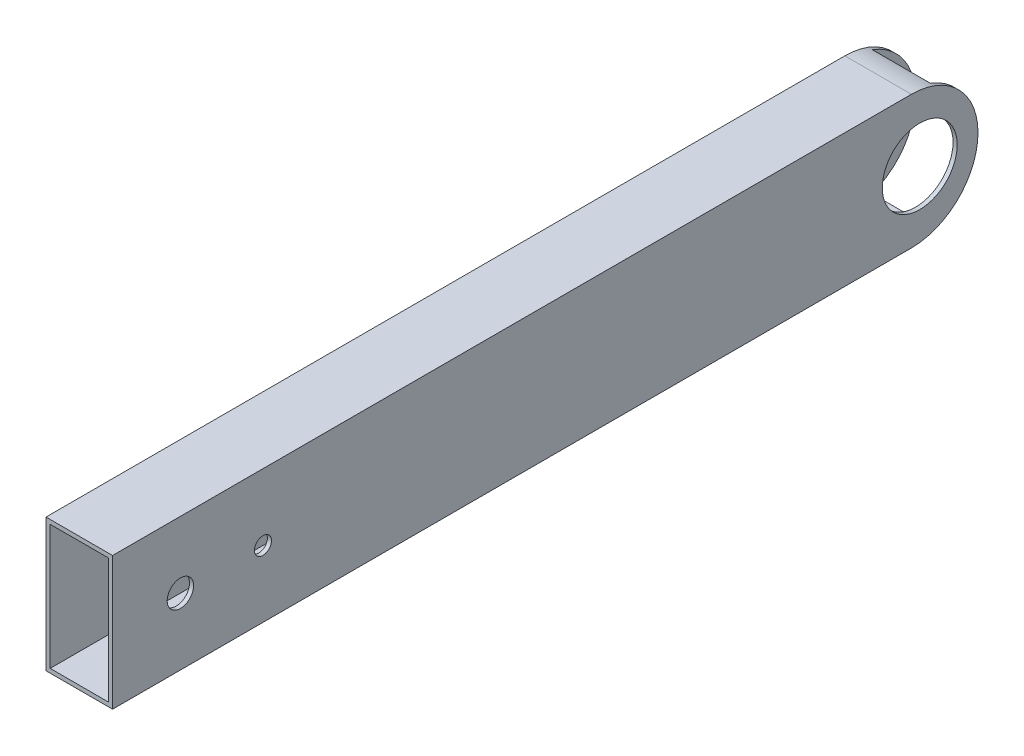
ISO-10303-21;
HEADER;
FILE_DESCRIPTION(('STEP AP214'),'2;1');
FILE_NAME('part.step','',(''),(''),'','','');
FILE_SCHEMA(('AUTOMOTIVE_DESIGN { 1 0 10303 214 1 1 1 1 }'));
ENDSEC;
DATA;
#1=APPLICATION_CONTEXT('core data for automotive mechanical design processes');
#2=APPLICATION_PROTOCOL_DEFINITION('international standard','automotive_design',2000,#1);
#3=PRODUCT_CONTEXT('',#1,'mechanical');
#4=PRODUCT('Part','Part','',(#3));
#5=PRODUCT_RELATED_PRODUCT_CATEGORY('part','',(#4));
#6=PRODUCT_DEFINITION_FORMATION('','',#4);
#7=PRODUCT_DEFINITION_CONTEXT('part definition',#1,'design');
#8=PRODUCT_DEFINITION('design','',#6,#7);
#9=PRODUCT_DEFINITION_SHAPE('','',#8);
#10=(LENGTH_UNIT() NAMED_UNIT(*) SI_UNIT(.MILLI.,.METRE.));
#11=(NAMED_UNIT(*) PLANE_ANGLE_UNIT() SI_UNIT($,.RADIAN.));
#12=(NAMED_UNIT(*) SI_UNIT($,.STERADIAN.) SOLID_ANGLE_UNIT());
#13=UNCERTAINTY_MEASURE_WITH_UNIT(LENGTH_MEASURE(1.E-05),#10,'distance_accuracy_value','');
#14=(GEOMETRIC_REPRESENTATION_CONTEXT(3) GLOBAL_UNCERTAINTY_ASSIGNED_CONTEXT((#13)) GLOBAL_UNIT_ASSIGNED_CONTEXT((#10,
#11,#12)) REPRESENTATION_CONTEXT('',''));
#15=CARTESIAN_POINT('',(0.,0.,0.));
#16=DIRECTION('',(0.,0.,1.));
#17=DIRECTION('',(1.,0.,0.));
#18=AXIS2_PLACEMENT_3D('',#15,#16,#17);
#19=CARTESIAN_POINT('',(12.7,0.,-142.875));
#20=DIRECTION('',(1.,0.,0.));
#21=DIRECTION('',(0.,0.,-1.));
#22=AXIS2_PLACEMENT_3D('',#19,#20,#21);
#23=CYLINDRICAL_SURFACE('',#22,14.2875);
#24=CARTESIAN_POINT('',(-11.1125,0.,-142.875));
#25=DIRECTION('',(1.,0.,0.));
#26=DIRECTION('',(0.,0.,-1.));
#27=AXIS2_PLACEMENT_3D('',#24,#25,#26);
#28=CIRCLE('',#27,14.2875);
#29=CARTESIAN_POINT('',(-11.1125,0.,-157.1625));
#30=VERTEX_POINT('',#29);
#31=EDGE_CURVE('E99',#30,#30,#28,.F.);
#32=ORIENTED_EDGE('',*,*,#31,.F.);
#33=EDGE_LOOP('',(#32));
#34=FACE_BOUND('',#33,.T.);
#35=CARTESIAN_POINT('',(-12.7,0.,-142.875));
#36=DIRECTION('',(1.,0.,0.));
#37=DIRECTION('',(0.,0.,-1.));
#38=AXIS2_PLACEMENT_3D('',#35,#36,#37);
#39=CIRCLE('',#38,14.2875);
#40=CARTESIAN_POINT('',(-12.7,0.,-157.1625));
#41=VERTEX_POINT('',#40);
#42=EDGE_CURVE('E19',#41,#41,#39,.T.);
#43=ORIENTED_EDGE('',*,*,#42,.F.);
#44=EDGE_LOOP('',(#43));
#45=FACE_BOUND('',#44,.T.);
#46=ADVANCED_FACE('F16',(#34,#45),#23,.F.);
#47=CARTESIAN_POINT('',(-12.7,0.,107.714500000008));
#48=DIRECTION('',(-1.,0.,0.));
#49=DIRECTION('',(0.,0.,1.));
#50=AXIS2_PLACEMENT_3D('',#47,#48,#49);
#51=CYLINDRICAL_SURFACE('',#50,7.9375);
#52=CARTESIAN_POINT('',(-11.1125,0.,107.714500000008));
#53=DIRECTION('',(-1.,0.,0.));
#54=DIRECTION('',(0.,0.,1.));
#55=AXIS2_PLACEMENT_3D('',#52,#53,#54);
#56=CIRCLE('',#55,7.9375);
#57=CARTESIAN_POINT('',(-11.1125,0.,115.652000000008));
#58=VERTEX_POINT('',#57);
#59=EDGE_CURVE('E150',#58,#58,#56,.T.);
#60=ORIENTED_EDGE('',*,*,#59,.F.);
#61=EDGE_LOOP('',(#60));
#62=FACE_BOUND('',#61,.T.);
#63=CARTESIAN_POINT('',(-12.7,0.,107.714500000008));
#64=DIRECTION('',(-1.,0.,0.));
#65=DIRECTION('',(0.,0.,1.));
#66=AXIS2_PLACEMENT_3D('',#63,#64,#65);
#67=CIRCLE('',#66,7.9375);
#68=CARTESIAN_POINT('',(-12.7,0.,115.652000000008));
#69=VERTEX_POINT('',#68);
#70=EDGE_CURVE('E100',#69,#69,#67,.F.);
#71=ORIENTED_EDGE('',*,*,#70,.F.);
#72=EDGE_LOOP('',(#71));
#73=FACE_BOUND('',#72,.T.);
#74=ADVANCED_FACE('F163',(#62,#73),#51,.F.);
#75=CARTESIAN_POINT('',(-12.7,25.4,-165.1));
#76=DIRECTION('',(-1.,0.,0.));
#77=DIRECTION('',(0.,0.,1.));
#78=AXIS2_PLACEMENT_3D('',#75,#76,#77);
#79=PLANE('',#78);
#80=ORIENTED_EDGE('',*,*,#70,.T.);
#81=EDGE_LOOP('',(#80));
#82=FACE_BOUND('',#81,.T.);
#83=ORIENTED_EDGE('',*,*,#42,.T.);
#84=EDGE_LOOP('',(#83));
#85=FACE_BOUND('',#84,.T.);
#86=DIRECTION('',(0.,0.,1.));
#87=VECTOR('',#86,1.);
#88=CARTESIAN_POINT('',(-12.7,25.4,-165.1));
#89=LINE('',#88,#87);
#90=CARTESIAN_POINT('',(-12.7,25.4,-139.7));
#91=VERTEX_POINT('',#90);
#92=CARTESIAN_POINT('',(-12.7,25.4,165.1));
#93=VERTEX_POINT('',#92);
#94=EDGE_CURVE('E334',#91,#93,#89,.T.);
#95=ORIENTED_EDGE('',*,*,#94,.F.);
#96=CARTESIAN_POINT('',(-12.7,0.,-139.7));
#97=DIRECTION('',(1.,0.,0.));
#98=DIRECTION('',(0.,0.,-1.));
#99=AXIS2_PLACEMENT_3D('',#96,#97,#98);
#100=CIRCLE('',#99,25.4);
#101=CARTESIAN_POINT('',(-12.7,-25.4,-139.7));
#102=VERTEX_POINT('',#101);
#103=EDGE_CURVE('E64',#102,#91,#100,.T.);
#104=ORIENTED_EDGE('',*,*,#103,.F.);
#105=DIRECTION('',(0.,0.,-1.));
#106=VECTOR('',#105,1.);
#107=CARTESIAN_POINT('',(-12.7,-25.4,-165.1));
#108=LINE('',#107,#106);
#109=CARTESIAN_POINT('',(-12.7,-25.4,165.1));
#110=VERTEX_POINT('',#109);
#111=EDGE_CURVE('E149',#110,#102,#108,.T.);
#112=ORIENTED_EDGE('',*,*,#111,.F.);
#113=DIRECTION('',(0.,1.,0.));
#114=VECTOR('',#113,1.);
#115=CARTESIAN_POINT('',(-12.7,0.,165.1));
#116=LINE('',#115,#114);
#117=EDGE_CURVE('E71',#93,#110,#116,.F.);
#118=ORIENTED_EDGE('',*,*,#117,.F.);
#119=EDGE_LOOP('',(#95,#104,#112,#118));
#120=FACE_BOUND('',#119,.T.);
#121=ADVANCED_FACE('F160',(#82,#85,#120),#79,.T.);
#122=CARTESIAN_POINT('',(-11.1125,23.8125,-165.1));
#123=DIRECTION('',(0.,-1.,0.));
#124=DIRECTION('',(0.,0.,-1.));
#125=AXIS2_PLACEMENT_3D('',#122,#123,#124);
#126=PLANE('',#125);
#127=DIRECTION('',(0.,0.,-1.));
#128=VECTOR('',#127,1.);
#129=CARTESIAN_POINT('',(-11.1125,23.8125,-165.1));
#130=LINE('',#129,#128);
#131=CARTESIAN_POINT('',(-11.1125,23.8124999999995,-148.538825925994));
#132=VERTEX_POINT('',#131);
#133=CARTESIAN_POINT('',(-11.1125,23.8125,165.1));
#134=VERTEX_POINT('',#133);
#135=EDGE_CURVE('E89',#132,#134,#130,.F.);
#136=ORIENTED_EDGE('',*,*,#135,.F.);
#137=DIRECTION('',(1.,0.,0.));
#138=VECTOR('',#137,1.);
#139=CARTESIAN_POINT('',(-45.81144,23.812499999999,-148.538825925995));
#140=LINE('',#139,#138);
#141=CARTESIAN_POINT('',(11.1125,23.8124999999995,-148.538825925994));
#142=VERTEX_POINT('',#141);
#143=EDGE_CURVE('E146',#142,#132,#140,.F.);
#144=ORIENTED_EDGE('',*,*,#143,.F.);
#145=DIRECTION('',(0.,0.,1.));
#146=VECTOR('',#145,1.);
#147=CARTESIAN_POINT('',(11.1125,23.8125,-165.1));
#148=LINE('',#147,#146);
#149=CARTESIAN_POINT('',(11.1125,23.8125,165.1));
#150=VERTEX_POINT('',#149);
#151=EDGE_CURVE('E106',#150,#142,#148,.F.);
#152=ORIENTED_EDGE('',*,*,#151,.F.);
#153=DIRECTION('',(1.,0.,0.));
#154=VECTOR('',#153,1.);
#155=CARTESIAN_POINT('',(0.,23.8125,165.1));
#156=LINE('',#155,#154);
#157=EDGE_CURVE('E103',#134,#150,#156,.T.);
#158=ORIENTED_EDGE('',*,*,#157,.F.);
#159=EDGE_LOOP('',(#136,#144,#152,#158));
#160=FACE_BOUND('',#159,.T.);
#161=ADVANCED_FACE('F104',(#160),#126,.T.);
#162=CARTESIAN_POINT('',(-11.1125,-23.8125,-165.1));
#163=DIRECTION('',(1.,0.,0.));
#164=DIRECTION('',(0.,0.,-1.));
#165=AXIS2_PLACEMENT_3D('',#162,#163,#164);
#166=PLANE('',#165);
#167=ORIENTED_EDGE('',*,*,#59,.T.);
#168=EDGE_LOOP('',(#167));
#169=FACE_BOUND('',#168,.T.);
#170=ORIENTED_EDGE('',*,*,#31,.T.);
#171=EDGE_LOOP('',(#170));
#172=FACE_BOUND('',#171,.T.);
#173=DIRECTION('',(0.,0.,1.));
#174=VECTOR('',#173,1.);
#175=CARTESIAN_POINT('',(-11.1125,-23.8125,-165.1));
#176=LINE('',#175,#174);
#177=CARTESIAN_POINT('',(-11.1125,-23.8124999999995,-148.538825925994));
#178=VERTEX_POINT('',#177);
#179=CARTESIAN_POINT('',(-11.1125,-23.8125,165.1));
#180=VERTEX_POINT('',#179);
#181=EDGE_CURVE('E84',#178,#180,#176,.T.);
#182=ORIENTED_EDGE('',*,*,#181,.F.);
#183=CARTESIAN_POINT('',(-11.1125,0.,-139.7));
#184=DIRECTION('',(1.,0.,0.));
#185=DIRECTION('',(0.,0.,-1.));
#186=AXIS2_PLACEMENT_3D('',#183,#184,#185);
#187=CIRCLE('',#186,25.4);
#188=EDGE_CURVE('E96',#132,#178,#187,.F.);
#189=ORIENTED_EDGE('',*,*,#188,.F.);
#190=ORIENTED_EDGE('',*,*,#135,.T.);
#191=DIRECTION('',(0.,1.,0.));
#192=VECTOR('',#191,1.);
#193=CARTESIAN_POINT('',(-11.1125,0.,165.1));
#194=LINE('',#193,#192);
#195=EDGE_CURVE('E93',#180,#134,#194,.T.);
#196=ORIENTED_EDGE('',*,*,#195,.F.);
#197=EDGE_LOOP('',(#182,#189,#190,#196));
#198=FACE_BOUND('',#197,.T.);
#199=ADVANCED_FACE('F91',(#169,#172,#198),#166,.T.);
#200=CARTESIAN_POINT('',(11.1125,-23.8125,-165.1));
#201=DIRECTION('',(0.,1.,0.));
#202=DIRECTION('',(0.,0.,1.));
#203=AXIS2_PLACEMENT_3D('',#200,#201,#202);
#204=PLANE('',#203);
#205=DIRECTION('',(0.,0.,1.));
#206=VECTOR('',#205,1.);
#207=CARTESIAN_POINT('',(11.1125,-23.8125,-165.1));
#208=LINE('',#207,#206);
#209=CARTESIAN_POINT('',(11.1125,-23.8124999999995,-148.538825925994));
#210=VERTEX_POINT('',#209);
#211=CARTESIAN_POINT('',(11.1125,-23.8125,165.1));
#212=VERTEX_POINT('',#211);
#213=EDGE_CURVE('E314',#210,#212,#208,.T.);
#214=ORIENTED_EDGE('',*,*,#213,.F.);
#215=DIRECTION('',(1.,0.,0.));
#216=VECTOR('',#215,1.);
#217=CARTESIAN_POINT('',(-45.81144,-23.812499999999,-148.538825925995));
#218=LINE('',#217,#216);
#219=EDGE_CURVE('E144',#178,#210,#218,.T.);
#220=ORIENTED_EDGE('',*,*,#219,.F.);
#221=ORIENTED_EDGE('',*,*,#181,.T.);
#222=DIRECTION('',(1.,0.,0.));
#223=VECTOR('',#222,1.);
#224=CARTESIAN_POINT('',(0.,-23.8125,165.1));
#225=LINE('',#224,#223);
#226=EDGE_CURVE('E113',#212,#180,#225,.F.);
#227=ORIENTED_EDGE('',*,*,#226,.F.);
#228=EDGE_LOOP('',(#214,#220,#221,#227));
#229=FACE_BOUND('',#228,.T.);
#230=ADVANCED_FACE('F207',(#229),#204,.T.);
#231=CARTESIAN_POINT('',(11.1125,23.8125,-165.1));
#232=DIRECTION('',(-1.,0.,0.));
#233=DIRECTION('',(0.,0.,1.));
#234=AXIS2_PLACEMENT_3D('',#231,#232,#233);
#235=PLANE('',#234);
#236=CARTESIAN_POINT('',(11.1125,0.,107.714500000008));
#237=DIRECTION('',(1.,0.,0.));
#238=DIRECTION('',(0.,0.,-1.));
#239=AXIS2_PLACEMENT_3D('',#236,#237,#238);
#240=CIRCLE('',#239,3.2639);
#241=CARTESIAN_POINT('',(11.1125,0.,104.450600000008));
#242=VERTEX_POINT('',#241);
#243=EDGE_CURVE('E131',#242,#242,#240,.T.);
#244=ORIENTED_EDGE('',*,*,#243,.T.);
#245=EDGE_LOOP('',(#244));
#246=FACE_BOUND('',#245,.T.);
#247=CARTESIAN_POINT('',(11.1125,0.,-142.875));
#248=DIRECTION('',(1.,0.,0.));
#249=DIRECTION('',(0.,0.,-1.));
#250=AXIS2_PLACEMENT_3D('',#247,#248,#249);
#251=CIRCLE('',#250,14.2875);
#252=CARTESIAN_POINT('',(11.1125,0.,-157.1625));
#253=VERTEX_POINT('',#252);
#254=EDGE_CURVE('E135',#253,#253,#251,.T.);
#255=ORIENTED_EDGE('',*,*,#254,.T.);
#256=EDGE_LOOP('',(#255));
#257=FACE_BOUND('',#256,.T.);
#258=CARTESIAN_POINT('',(11.1125,0.,139.219406063374));
#259=DIRECTION('',(-1.,0.,0.));
#260=DIRECTION('',(0.,0.,1.));
#261=AXIS2_PLACEMENT_3D('',#258,#259,#260);
#262=CIRCLE('',#261,5.0419);
#263=CARTESIAN_POINT('',(11.1125,0.,144.261306063374));
#264=VERTEX_POINT('',#263);
#265=EDGE_CURVE('E138',#264,#264,#262,.F.);
#266=ORIENTED_EDGE('',*,*,#265,.T.);
#267=EDGE_LOOP('',(#266));
#268=FACE_BOUND('',#267,.T.);
#269=ORIENTED_EDGE('',*,*,#151,.T.);
#270=CARTESIAN_POINT('',(11.1125,0.,-139.7));
#271=DIRECTION('',(1.,0.,0.));
#272=DIRECTION('',(0.,0.,-1.));
#273=AXIS2_PLACEMENT_3D('',#270,#271,#272);
#274=CIRCLE('',#273,25.4);
#275=EDGE_CURVE('E141',#210,#142,#274,.T.);
#276=ORIENTED_EDGE('',*,*,#275,.F.);
#277=ORIENTED_EDGE('',*,*,#213,.T.);
#278=DIRECTION('',(0.,1.,0.));
#279=VECTOR('',#278,1.);
#280=CARTESIAN_POINT('',(11.1125,0.,165.1));
#281=LINE('',#280,#279);
#282=EDGE_CURVE('E110',#150,#212,#281,.F.);
#283=ORIENTED_EDGE('',*,*,#282,.F.);
#284=EDGE_LOOP('',(#269,#276,#277,#283));
#285=FACE_BOUND('',#284,.T.);
#286=ADVANCED_FACE('F203',(#246,#257,#268,#285),#235,.T.);
#287=CARTESIAN_POINT('',(12.7,25.4,-165.1));
#288=DIRECTION('',(0.,1.,0.));
#289=DIRECTION('',(0.,0.,1.));
#290=AXIS2_PLACEMENT_3D('',#287,#288,#289);
#291=PLANE('',#290);
#292=DIRECTION('',(0.,0.,-1.));
#293=VECTOR('',#292,1.);
#294=CARTESIAN_POINT('',(12.7,25.4,-165.1));
#295=LINE('',#294,#293);
#296=CARTESIAN_POINT('',(12.7,25.4,-139.7));
#297=VERTEX_POINT('',#296);
#298=CARTESIAN_POINT('',(12.7,25.4,165.1));
#299=VERTEX_POINT('',#298);
#300=EDGE_CURVE('E134',#297,#299,#295,.F.);
#301=ORIENTED_EDGE('',*,*,#300,.F.);
#302=DIRECTION('',(1.,0.,0.));
#303=VECTOR('',#302,1.);
#304=CARTESIAN_POINT('',(-45.81144,25.4,-139.7));
#305=LINE('',#304,#303);
#306=EDGE_CURVE('E148',#91,#297,#305,.T.);
#307=ORIENTED_EDGE('',*,*,#306,.F.);
#308=ORIENTED_EDGE('',*,*,#94,.T.);
#309=DIRECTION('',(1.,0.,0.));
#310=VECTOR('',#309,1.);
#311=CARTESIAN_POINT('',(0.,25.4,165.1));
#312=LINE('',#311,#310);
#313=EDGE_CURVE('E115',#299,#93,#312,.F.);
#314=ORIENTED_EDGE('',*,*,#313,.F.);
#315=EDGE_LOOP('',(#301,#307,#308,#314));
#316=FACE_BOUND('',#315,.T.);
#317=ADVANCED_FACE('F200',(#316),#291,.T.);
#318=CARTESIAN_POINT('',(0.,0.,165.1));
#319=DIRECTION('',(0.,0.,1.));
#320=DIRECTION('',(1.,0.,0.));
#321=AXIS2_PLACEMENT_3D('',#318,#319,#320);
#322=PLANE('',#321);
#323=ORIENTED_EDGE('',*,*,#157,.T.);
#324=ORIENTED_EDGE('',*,*,#282,.T.);
#325=ORIENTED_EDGE('',*,*,#226,.T.);
#326=ORIENTED_EDGE('',*,*,#195,.T.);
#327=EDGE_LOOP('',(#323,#324,#325,#326));
#328=FACE_BOUND('',#327,.T.);
#329=DIRECTION('',(0.,1.,0.));
#330=VECTOR('',#329,1.);
#331=CARTESIAN_POINT('',(12.7,-25.4,165.1));
#332=LINE('',#331,#330);
#333=CARTESIAN_POINT('',(12.7,-25.4,165.1));
#334=VERTEX_POINT('',#333);
#335=EDGE_CURVE('E353',#299,#334,#332,.F.);
#336=ORIENTED_EDGE('',*,*,#335,.F.);
#337=ORIENTED_EDGE('',*,*,#313,.T.);
#338=ORIENTED_EDGE('',*,*,#117,.T.);
#339=DIRECTION('',(1.,0.,0.));
#340=VECTOR('',#339,1.);
#341=CARTESIAN_POINT('',(-12.7,-25.4,165.1));
#342=LINE('',#341,#340);
#343=EDGE_CURVE('E331',#334,#110,#342,.F.);
#344=ORIENTED_EDGE('',*,*,#343,.F.);
#345=EDGE_LOOP('',(#336,#337,#338,#344));
#346=FACE_BOUND('',#345,.T.);
#347=ADVANCED_FACE('F112',(#328,#346),#322,.T.);
#348=CARTESIAN_POINT('',(-12.7,-25.4,-165.1));
#349=DIRECTION('',(0.,-1.,0.));
#350=DIRECTION('',(0.,0.,-1.));
#351=AXIS2_PLACEMENT_3D('',#348,#349,#350);
#352=PLANE('',#351);
#353=ORIENTED_EDGE('',*,*,#111,.T.);
#354=DIRECTION('',(1.,0.,0.));
#355=VECTOR('',#354,1.);
#356=CARTESIAN_POINT('',(-45.81144,-25.4,-139.7));
#357=LINE('',#356,#355);
#358=CARTESIAN_POINT('',(12.7,-25.4,-139.7));
#359=VERTEX_POINT('',#358);
#360=EDGE_CURVE('E34',#359,#102,#357,.F.);
#361=ORIENTED_EDGE('',*,*,#360,.F.);
#362=DIRECTION('',(0.,0.,-1.));
#363=VECTOR('',#362,1.);
#364=CARTESIAN_POINT('',(12.7,-25.4,-165.1));
#365=LINE('',#364,#363);
#366=EDGE_CURVE('E130',#334,#359,#365,.T.);
#367=ORIENTED_EDGE('',*,*,#366,.F.);
#368=ORIENTED_EDGE('',*,*,#343,.T.);
#369=EDGE_LOOP('',(#353,#361,#367,#368));
#370=FACE_BOUND('',#369,.T.);
#371=ADVANCED_FACE('F194',(#370),#352,.T.);
#372=CARTESIAN_POINT('',(-45.81144,0.,-139.7));
#373=DIRECTION('',(1.,0.,0.));
#374=DIRECTION('',(0.,0.,-1.));
#375=AXIS2_PLACEMENT_3D('',#372,#373,#374);
#376=CYLINDRICAL_SURFACE('',#375,25.4);
#377=ORIENTED_EDGE('',*,*,#219,.T.);
#378=ORIENTED_EDGE('',*,*,#275,.T.);
#379=ORIENTED_EDGE('',*,*,#143,.T.);
#380=ORIENTED_EDGE('',*,*,#188,.T.);
#381=EDGE_LOOP('',(#377,#378,#379,#380));
#382=FACE_BOUND('',#381,.T.);
#383=CARTESIAN_POINT('',(12.7,0.,-139.7));
#384=DIRECTION('',(1.,0.,0.));
#385=DIRECTION('',(0.,0.,-1.));
#386=AXIS2_PLACEMENT_3D('',#383,#384,#385);
#387=CIRCLE('',#386,25.4);
#388=EDGE_CURVE('E127',#359,#297,#387,.T.);
#389=ORIENTED_EDGE('',*,*,#388,.F.);
#390=ORIENTED_EDGE('',*,*,#360,.T.);
#391=ORIENTED_EDGE('',*,*,#103,.T.);
#392=ORIENTED_EDGE('',*,*,#306,.T.);
#393=EDGE_LOOP('',(#389,#390,#391,#392));
#394=FACE_BOUND('',#393,.T.);
#395=ADVANCED_FACE('F190',(#382,#394),#376,.T.);
#396=CARTESIAN_POINT('',(11.1125,0.,139.219406063374));
#397=DIRECTION('',(-1.,0.,0.));
#398=DIRECTION('',(0.,0.,1.));
#399=AXIS2_PLACEMENT_3D('',#396,#397,#398);
#400=CYLINDRICAL_SURFACE('',#399,5.0419);
#401=ORIENTED_EDGE('',*,*,#265,.F.);
#402=EDGE_LOOP('',(#401));
#403=FACE_BOUND('',#402,.T.);
#404=CARTESIAN_POINT('',(12.7,0.,139.219406063374));
#405=DIRECTION('',(-1.,0.,0.));
#406=DIRECTION('',(0.,0.,1.));
#407=AXIS2_PLACEMENT_3D('',#404,#405,#406);
#408=CIRCLE('',#407,5.0419);
#409=CARTESIAN_POINT('',(12.7,0.,144.261306063374));
#410=VERTEX_POINT('',#409);
#411=EDGE_CURVE('E124',#410,#410,#408,.T.);
#412=ORIENTED_EDGE('',*,*,#411,.F.);
#413=EDGE_LOOP('',(#412));
#414=FACE_BOUND('',#413,.T.);
#415=ADVANCED_FACE('F186',(#403,#414),#400,.F.);
#416=CARTESIAN_POINT('',(12.7,0.,-142.875));
#417=DIRECTION('',(1.,0.,0.));
#418=DIRECTION('',(0.,0.,-1.));
#419=AXIS2_PLACEMENT_3D('',#416,#417,#418);
#420=CYLINDRICAL_SURFACE('',#419,14.2875);
#421=ORIENTED_EDGE('',*,*,#254,.F.);
#422=EDGE_LOOP('',(#421));
#423=FACE_BOUND('',#422,.T.);
#424=CARTESIAN_POINT('',(12.7,0.,-142.875));
#425=DIRECTION('',(1.,0.,0.));
#426=DIRECTION('',(0.,0.,-1.));
#427=AXIS2_PLACEMENT_3D('',#424,#425,#426);
#428=CIRCLE('',#427,14.2875);
#429=CARTESIAN_POINT('',(12.7,0.,-157.1625));
#430=VERTEX_POINT('',#429);
#431=EDGE_CURVE('E25',#430,#430,#428,.F.);
#432=ORIENTED_EDGE('',*,*,#431,.F.);
#433=EDGE_LOOP('',(#432));
#434=FACE_BOUND('',#433,.T.);
#435=ADVANCED_FACE('F179',(#423,#434),#420,.F.);
#436=CARTESIAN_POINT('',(12.7,0.,107.714500000008));
#437=DIRECTION('',(1.,0.,0.));
#438=DIRECTION('',(0.,0.,-1.));
#439=AXIS2_PLACEMENT_3D('',#436,#437,#438);
#440=CYLINDRICAL_SURFACE('',#439,3.2639);
#441=ORIENTED_EDGE('',*,*,#243,.F.);
#442=EDGE_LOOP('',(#441));
#443=FACE_BOUND('',#442,.T.);
#444=CARTESIAN_POINT('',(12.7,0.,107.714500000008));
#445=DIRECTION('',(1.,0.,0.));
#446=DIRECTION('',(0.,0.,-1.));
#447=AXIS2_PLACEMENT_3D('',#444,#445,#446);
#448=CIRCLE('',#447,3.2639);
#449=CARTESIAN_POINT('',(12.7,0.,104.450600000008));
#450=VERTEX_POINT('',#449);
#451=EDGE_CURVE('E11',#450,#450,#448,.F.);
#452=ORIENTED_EDGE('',*,*,#451,.F.);
#453=EDGE_LOOP('',(#452));
#454=FACE_BOUND('',#453,.T.);
#455=ADVANCED_FACE('F173',(#443,#454),#440,.F.);
#456=CARTESIAN_POINT('',(12.7,-25.4,-165.1));
#457=DIRECTION('',(1.,0.,0.));
#458=DIRECTION('',(0.,0.,-1.));
#459=AXIS2_PLACEMENT_3D('',#456,#457,#458);
#460=PLANE('',#459);
#461=ORIENTED_EDGE('',*,*,#451,.T.);
#462=EDGE_LOOP('',(#461));
#463=FACE_BOUND('',#462,.T.);
#464=ORIENTED_EDGE('',*,*,#431,.T.);
#465=EDGE_LOOP('',(#464));
#466=FACE_BOUND('',#465,.T.);
#467=ORIENTED_EDGE('',*,*,#411,.T.);
#468=EDGE_LOOP('',(#467));
#469=FACE_BOUND('',#468,.T.);
#470=ORIENTED_EDGE('',*,*,#366,.T.);
#471=ORIENTED_EDGE('',*,*,#388,.T.);
#472=ORIENTED_EDGE('',*,*,#300,.T.);
#473=ORIENTED_EDGE('',*,*,#335,.T.);
#474=EDGE_LOOP('',(#470,#471,#472,#473));
#475=FACE_BOUND('',#474,.T.);
#476=ADVANCED_FACE('F171',(#463,#466,#469,#475),#460,.T.);
#477=CLOSED_SHELL('',(#46,#74,#121,#161,#199,#230,#286,#317,#347,#371,#395,#415,#435,#455,#476));
#478=MANIFOLD_SOLID_BREP('B1',#477);
#479=ADVANCED_BREP_SHAPE_REPRESENTATION('',(#18,#478),#14);
#480=SHAPE_DEFINITION_REPRESENTATION(#9,#479);
ENDSEC;
END-ISO-10303-21;
